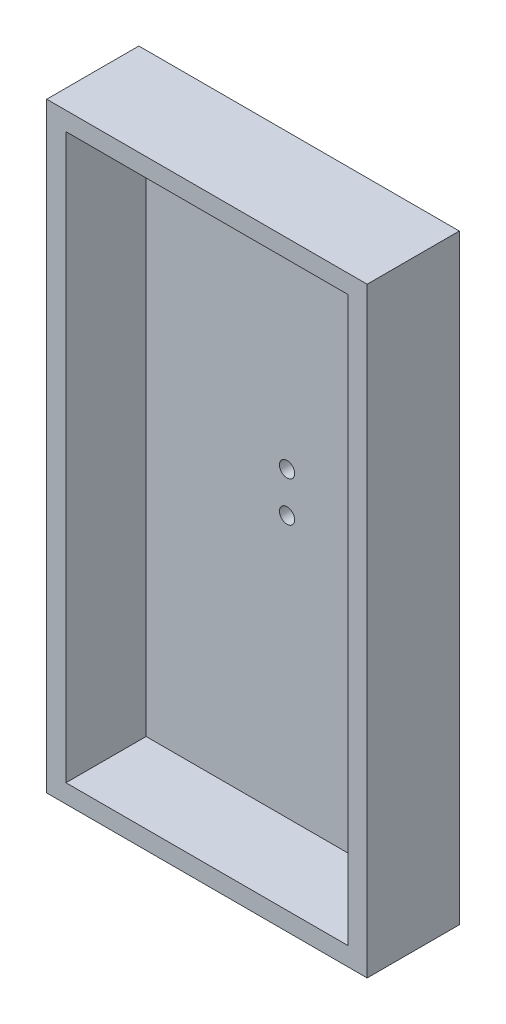
ISO-10303-21;
HEADER;
FILE_DESCRIPTION(('STEP AP214'),'2;1');
FILE_NAME('part.step','',(''),(''),'','','');
FILE_SCHEMA(('AUTOMOTIVE_DESIGN { 1 0 10303 214 1 1 1 1 }'));
ENDSEC;
DATA;
#1=APPLICATION_CONTEXT('core data for automotive mechanical design processes');
#2=APPLICATION_PROTOCOL_DEFINITION('international standard','automotive_design',2000,#1);
#3=PRODUCT_CONTEXT('',#1,'mechanical');
#4=PRODUCT('Part','Part','',(#3));
#5=PRODUCT_RELATED_PRODUCT_CATEGORY('part','',(#4));
#6=PRODUCT_DEFINITION_FORMATION('','',#4);
#7=PRODUCT_DEFINITION_CONTEXT('part definition',#1,'design');
#8=PRODUCT_DEFINITION('design','',#6,#7);
#9=PRODUCT_DEFINITION_SHAPE('','',#8);
#10=(LENGTH_UNIT() NAMED_UNIT(*) SI_UNIT(.MILLI.,.METRE.));
#11=(NAMED_UNIT(*) PLANE_ANGLE_UNIT() SI_UNIT($,.RADIAN.));
#12=(NAMED_UNIT(*) SI_UNIT($,.STERADIAN.) SOLID_ANGLE_UNIT());
#13=UNCERTAINTY_MEASURE_WITH_UNIT(LENGTH_MEASURE(1.E-05),#10,'distance_accuracy_value','');
#14=(GEOMETRIC_REPRESENTATION_CONTEXT(3) GLOBAL_UNCERTAINTY_ASSIGNED_CONTEXT((#13)) GLOBAL_UNIT_ASSIGNED_CONTEXT((#10,
#11,#12)) REPRESENTATION_CONTEXT('',''));
#15=CARTESIAN_POINT('',(0.,0.,0.));
#16=DIRECTION('',(0.,0.,1.));
#17=DIRECTION('',(1.,0.,0.));
#18=AXIS2_PLACEMENT_3D('',#15,#16,#17);
#19=CARTESIAN_POINT('',(40.,75.,3.));
#20=DIRECTION('',(-1.,0.,0.));
#21=DIRECTION('',(0.,-1.,0.));
#22=AXIS2_PLACEMENT_3D('',#19,#20,#21);
#23=PLANE('',#22);
#24=DIRECTION('',(0.,1.,0.));
#25=VECTOR('',#24,1.);
#26=CARTESIAN_POINT('',(40.,75.,0.));
#27=LINE('',#26,#25);
#28=CARTESIAN_POINT('',(40.,-75.,0.));
#29=VERTEX_POINT('',#28);
#30=CARTESIAN_POINT('',(40.,75.,0.));
#31=VERTEX_POINT('',#30);
#32=EDGE_CURVE('E243',#29,#31,#27,.T.);
#33=ORIENTED_EDGE('',*,*,#32,.T.);
#34=DIRECTION('',(0.,0.,-1.));
#35=VECTOR('',#34,1.);
#36=CARTESIAN_POINT('',(40.,75.,3.));
#37=LINE('',#36,#35);
#38=CARTESIAN_POINT('',(40.,75.,23.));
#39=VERTEX_POINT('',#38);
#40=EDGE_CURVE('E11',#39,#31,#37,.T.);
#41=ORIENTED_EDGE('',*,*,#40,.F.);
#42=DIRECTION('',(0.,1.,0.));
#43=VECTOR('',#42,1.);
#44=CARTESIAN_POINT('',(40.,75.,23.));
#45=LINE('',#44,#43);
#46=CARTESIAN_POINT('',(40.,-75.,23.));
#47=VERTEX_POINT('',#46);
#48=EDGE_CURVE('E144',#47,#39,#45,.T.);
#49=ORIENTED_EDGE('',*,*,#48,.F.);
#50=DIRECTION('',(0.,0.,-1.));
#51=VECTOR('',#50,1.);
#52=CARTESIAN_POINT('',(40.,-75.,3.));
#53=LINE('',#52,#51);
#54=EDGE_CURVE('E265',#47,#29,#53,.T.);
#55=ORIENTED_EDGE('',*,*,#54,.T.);
#56=EDGE_LOOP('',(#33,#41,#49,#55));
#57=FACE_BOUND('',#56,.T.);
#58=ADVANCED_FACE('F39',(#57),#23,.F.);
#59=CARTESIAN_POINT('',(-40.,75.,3.));
#60=DIRECTION('',(0.,-1.,0.));
#61=DIRECTION('',(0.,0.,-1.));
#62=AXIS2_PLACEMENT_3D('',#59,#60,#61);
#63=PLANE('',#62);
#64=DIRECTION('',(-1.,0.,0.));
#65=VECTOR('',#64,1.);
#66=CARTESIAN_POINT('',(-40.,75.,0.));
#67=LINE('',#66,#65);
#68=CARTESIAN_POINT('',(-40.,75.,0.));
#69=VERTEX_POINT('',#68);
#70=EDGE_CURVE('E256',#31,#69,#67,.T.);
#71=ORIENTED_EDGE('',*,*,#70,.T.);
#72=DIRECTION('',(0.,0.,-1.));
#73=VECTOR('',#72,1.);
#74=CARTESIAN_POINT('',(-40.,75.,3.));
#75=LINE('',#74,#73);
#76=CARTESIAN_POINT('',(-40.,75.,23.));
#77=VERTEX_POINT('',#76);
#78=EDGE_CURVE('E47',#77,#69,#75,.T.);
#79=ORIENTED_EDGE('',*,*,#78,.F.);
#80=DIRECTION('',(-1.,0.,0.));
#81=VECTOR('',#80,1.);
#82=CARTESIAN_POINT('',(-40.,75.,23.));
#83=LINE('',#82,#81);
#84=EDGE_CURVE('E179',#39,#77,#83,.T.);
#85=ORIENTED_EDGE('',*,*,#84,.F.);
#86=ORIENTED_EDGE('',*,*,#40,.T.);
#87=EDGE_LOOP('',(#71,#79,#85,#86));
#88=FACE_BOUND('',#87,.T.);
#89=ADVANCED_FACE('F290',(#88),#63,.F.);
#90=CARTESIAN_POINT('',(-40.,75.,3.));
#91=DIRECTION('',(1.,0.,0.));
#92=DIRECTION('',(0.,1.,0.));
#93=AXIS2_PLACEMENT_3D('',#90,#91,#92);
#94=PLANE('',#93);
#95=DIRECTION('',(0.,-1.,0.));
#96=VECTOR('',#95,1.);
#97=CARTESIAN_POINT('',(-40.,75.,0.));
#98=LINE('',#97,#96);
#99=CARTESIAN_POINT('',(-40.,-75.,0.));
#100=VERTEX_POINT('',#99);
#101=EDGE_CURVE('E259',#69,#100,#98,.T.);
#102=ORIENTED_EDGE('',*,*,#101,.T.);
#103=DIRECTION('',(0.,0.,-1.));
#104=VECTOR('',#103,1.);
#105=CARTESIAN_POINT('',(-40.,-75.,3.));
#106=LINE('',#105,#104);
#107=CARTESIAN_POINT('',(-40.,-75.,23.));
#108=VERTEX_POINT('',#107);
#109=EDGE_CURVE('E269',#108,#100,#106,.T.);
#110=ORIENTED_EDGE('',*,*,#109,.F.);
#111=DIRECTION('',(0.,-1.,0.));
#112=VECTOR('',#111,1.);
#113=CARTESIAN_POINT('',(-40.,75.,23.));
#114=LINE('',#113,#112);
#115=EDGE_CURVE('E183',#77,#108,#114,.T.);
#116=ORIENTED_EDGE('',*,*,#115,.F.);
#117=ORIENTED_EDGE('',*,*,#78,.T.);
#118=EDGE_LOOP('',(#102,#110,#116,#117));
#119=FACE_BOUND('',#118,.T.);
#120=ADVANCED_FACE('F277',(#119),#94,.F.);
#121=CARTESIAN_POINT('',(-40.,-75.,3.));
#122=DIRECTION('',(0.,1.,0.));
#123=DIRECTION('',(0.,0.,1.));
#124=AXIS2_PLACEMENT_3D('',#121,#122,#123);
#125=PLANE('',#124);
#126=DIRECTION('',(1.,0.,0.));
#127=VECTOR('',#126,1.);
#128=CARTESIAN_POINT('',(-40.,-75.,0.));
#129=LINE('',#128,#127);
#130=EDGE_CURVE('E262',#100,#29,#129,.T.);
#131=ORIENTED_EDGE('',*,*,#130,.T.);
#132=ORIENTED_EDGE('',*,*,#54,.F.);
#133=DIRECTION('',(1.,0.,0.));
#134=VECTOR('',#133,1.);
#135=CARTESIAN_POINT('',(-40.,-75.,23.));
#136=LINE('',#135,#134);
#137=EDGE_CURVE('E187',#108,#47,#136,.T.);
#138=ORIENTED_EDGE('',*,*,#137,.F.);
#139=ORIENTED_EDGE('',*,*,#109,.T.);
#140=EDGE_LOOP('',(#131,#132,#138,#139));
#141=FACE_BOUND('',#140,.T.);
#142=ADVANCED_FACE('F285',(#141),#125,.F.);
#143=CARTESIAN_POINT('',(0.,0.,3.));
#144=DIRECTION('',(0.,0.,1.));
#145=DIRECTION('',(1.,0.,0.));
#146=AXIS2_PLACEMENT_3D('',#143,#144,#145);
#147=PLANE('',#146);
#148=DIRECTION('',(0.,1.,0.));
#149=VECTOR('',#148,1.);
#150=CARTESIAN_POINT('',(35.1911737822088,70.3823475644175,3.));
#151=LINE('',#150,#149);
#152=CARTESIAN_POINT('',(35.1911737822088,-70.3823475644175,3.));
#153=VERTEX_POINT('',#152);
#154=CARTESIAN_POINT('',(35.1911737822088,70.3823475644175,3.));
#155=VERTEX_POINT('',#154);
#156=EDGE_CURVE('E54',#153,#155,#151,.T.);
#157=ORIENTED_EDGE('',*,*,#156,.T.);
#158=DIRECTION('',(-1.,0.,0.));
#159=VECTOR('',#158,1.);
#160=CARTESIAN_POINT('',(-35.1911737822088,70.3823475644175,3.));
#161=LINE('',#160,#159);
#162=CARTESIAN_POINT('',(-35.1911737822088,70.3823475644175,3.));
#163=VERTEX_POINT('',#162);
#164=EDGE_CURVE('E58',#155,#163,#161,.T.);
#165=ORIENTED_EDGE('',*,*,#164,.T.);
#166=DIRECTION('',(0.,-1.,0.));
#167=VECTOR('',#166,1.);
#168=CARTESIAN_POINT('',(-35.1911737822088,70.3823475644175,3.));
#169=LINE('',#168,#167);
#170=CARTESIAN_POINT('',(-35.1911737822088,-70.3823475644175,3.));
#171=VERTEX_POINT('',#170);
#172=EDGE_CURVE('E163',#163,#171,#169,.T.);
#173=ORIENTED_EDGE('',*,*,#172,.T.);
#174=DIRECTION('',(1.,0.,0.));
#175=VECTOR('',#174,1.);
#176=CARTESIAN_POINT('',(-35.1911737822088,-70.3823475644175,3.));
#177=LINE('',#176,#175);
#178=EDGE_CURVE('E138',#171,#153,#177,.T.);
#179=ORIENTED_EDGE('',*,*,#178,.T.);
#180=EDGE_LOOP('',(#157,#165,#173,#179));
#181=FACE_BOUND('',#180,.T.);
#182=CARTESIAN_POINT('',(0.,5.,3.));
#183=DIRECTION('',(0.,0.,-1.));
#184=DIRECTION('',(-1.,0.,0.));
#185=AXIS2_PLACEMENT_3D('',#182,#183,#184);
#186=CIRCLE('',#185,1.9);
#187=CARTESIAN_POINT('',(-1.9,5.,3.));
#188=VERTEX_POINT('',#187);
#189=EDGE_CURVE('E192',#188,#188,#186,.T.);
#190=ORIENTED_EDGE('',*,*,#189,.T.);
#191=EDGE_LOOP('',(#190));
#192=FACE_BOUND('',#191,.T.);
#193=CARTESIAN_POINT('',(0.,-5.,3.));
#194=DIRECTION('',(0.,0.,-1.));
#195=DIRECTION('',(1.,0.,0.));
#196=AXIS2_PLACEMENT_3D('',#193,#194,#195);
#197=CIRCLE('',#196,1.9);
#198=CARTESIAN_POINT('',(1.9,-5.,3.));
#199=VERTEX_POINT('',#198);
#200=EDGE_CURVE('E201',#199,#199,#197,.T.);
#201=ORIENTED_EDGE('',*,*,#200,.T.);
#202=EDGE_LOOP('',(#201));
#203=FACE_BOUND('',#202,.T.);
#204=ADVANCED_FACE('F300',(#181,#192,#203),#147,.T.);
#205=CARTESIAN_POINT('',(0.,0.,0.));
#206=DIRECTION('',(0.,0.,1.));
#207=DIRECTION('',(1.,0.,0.));
#208=AXIS2_PLACEMENT_3D('',#205,#206,#207);
#209=PLANE('',#208);
#210=DIRECTION('',(1.,0.,0.));
#211=VECTOR('',#210,1.);
#212=CARTESIAN_POINT('',(-6.,-11.,0.));
#213=LINE('',#212,#211);
#214=CARTESIAN_POINT('',(-6.,-11.,0.));
#215=VERTEX_POINT('',#214);
#216=CARTESIAN_POINT('',(6.,-11.,0.));
#217=VERTEX_POINT('',#216);
#218=EDGE_CURVE('E213',#215,#217,#213,.T.);
#219=ORIENTED_EDGE('',*,*,#218,.T.);
#220=DIRECTION('',(0.,1.,0.));
#221=VECTOR('',#220,1.);
#222=CARTESIAN_POINT('',(6.,11.,0.));
#223=LINE('',#222,#221);
#224=CARTESIAN_POINT('',(6.,11.,0.));
#225=VERTEX_POINT('',#224);
#226=EDGE_CURVE('E196',#217,#225,#223,.T.);
#227=ORIENTED_EDGE('',*,*,#226,.T.);
#228=DIRECTION('',(-1.,0.,0.));
#229=VECTOR('',#228,1.);
#230=CARTESIAN_POINT('',(-6.,11.,0.));
#231=LINE('',#230,#229);
#232=CARTESIAN_POINT('',(-6.,11.,0.));
#233=VERTEX_POINT('',#232);
#234=EDGE_CURVE('E229',#225,#233,#231,.T.);
#235=ORIENTED_EDGE('',*,*,#234,.T.);
#236=DIRECTION('',(0.,-1.,0.));
#237=VECTOR('',#236,1.);
#238=CARTESIAN_POINT('',(-6.,11.,0.));
#239=LINE('',#238,#237);
#240=EDGE_CURVE('E233',#233,#215,#239,.T.);
#241=ORIENTED_EDGE('',*,*,#240,.T.);
#242=EDGE_LOOP('',(#219,#227,#235,#241));
#243=FACE_BOUND('',#242,.T.);
#244=ORIENTED_EDGE('',*,*,#32,.F.);
#245=ORIENTED_EDGE('',*,*,#130,.F.);
#246=ORIENTED_EDGE('',*,*,#101,.F.);
#247=ORIENTED_EDGE('',*,*,#70,.F.);
#248=EDGE_LOOP('',(#244,#245,#246,#247));
#249=FACE_BOUND('',#248,.T.);
#250=ADVANCED_FACE('F283',(#243,#249),#209,.F.);
#251=CARTESIAN_POINT('',(6.,11.,-5.));
#252=DIRECTION('',(1.,0.,0.));
#253=DIRECTION('',(0.,1.,0.));
#254=AXIS2_PLACEMENT_3D('',#251,#252,#253);
#255=PLANE('',#254);
#256=ORIENTED_EDGE('',*,*,#226,.F.);
#257=DIRECTION('',(0.,0.,1.));
#258=VECTOR('',#257,1.);
#259=CARTESIAN_POINT('',(6.,-11.,-5.));
#260=LINE('',#259,#258);
#261=CARTESIAN_POINT('',(6.,-11.,-5.));
#262=VERTEX_POINT('',#261);
#263=EDGE_CURVE('E240',#262,#217,#260,.T.);
#264=ORIENTED_EDGE('',*,*,#263,.F.);
#265=DIRECTION('',(0.,1.,0.));
#266=VECTOR('',#265,1.);
#267=CARTESIAN_POINT('',(6.,11.,-5.));
#268=LINE('',#267,#266);
#269=CARTESIAN_POINT('',(6.,11.,-5.));
#270=VERTEX_POINT('',#269);
#271=EDGE_CURVE('E208',#262,#270,#268,.T.);
#272=ORIENTED_EDGE('',*,*,#271,.T.);
#273=DIRECTION('',(0.,0.,1.));
#274=VECTOR('',#273,1.);
#275=CARTESIAN_POINT('',(6.,11.,-5.));
#276=LINE('',#275,#274);
#277=EDGE_CURVE('E225',#270,#225,#276,.T.);
#278=ORIENTED_EDGE('',*,*,#277,.T.);
#279=EDGE_LOOP('',(#256,#264,#272,#278));
#280=FACE_BOUND('',#279,.T.);
#281=ADVANCED_FACE('F303',(#280),#255,.T.);
#282=CARTESIAN_POINT('',(-6.,-11.,-5.));
#283=DIRECTION('',(0.,-1.,0.));
#284=DIRECTION('',(0.,0.,-1.));
#285=AXIS2_PLACEMENT_3D('',#282,#283,#284);
#286=PLANE('',#285);
#287=ORIENTED_EDGE('',*,*,#218,.F.);
#288=DIRECTION('',(0.,0.,1.));
#289=VECTOR('',#288,1.);
#290=CARTESIAN_POINT('',(-6.,-11.,-5.));
#291=LINE('',#290,#289);
#292=CARTESIAN_POINT('',(-6.,-11.,-5.));
#293=VERTEX_POINT('',#292);
#294=EDGE_CURVE('E244',#293,#215,#291,.T.);
#295=ORIENTED_EDGE('',*,*,#294,.F.);
#296=DIRECTION('',(1.,0.,0.));
#297=VECTOR('',#296,1.);
#298=CARTESIAN_POINT('',(-6.,-11.,-5.));
#299=LINE('',#298,#297);
#300=EDGE_CURVE('E221',#293,#262,#299,.T.);
#301=ORIENTED_EDGE('',*,*,#300,.T.);
#302=ORIENTED_EDGE('',*,*,#263,.T.);
#303=EDGE_LOOP('',(#287,#295,#301,#302));
#304=FACE_BOUND('',#303,.T.);
#305=ADVANCED_FACE('F309',(#304),#286,.T.);
#306=CARTESIAN_POINT('',(-6.,11.,-5.));
#307=DIRECTION('',(-1.,0.,0.));
#308=DIRECTION('',(0.,-1.,0.));
#309=AXIS2_PLACEMENT_3D('',#306,#307,#308);
#310=PLANE('',#309);
#311=ORIENTED_EDGE('',*,*,#240,.F.);
#312=DIRECTION('',(0.,0.,1.));
#313=VECTOR('',#312,1.);
#314=CARTESIAN_POINT('',(-6.,11.,-5.));
#315=LINE('',#314,#313);
#316=CARTESIAN_POINT('',(-6.,11.,-5.));
#317=VERTEX_POINT('',#316);
#318=EDGE_CURVE('E247',#317,#233,#315,.T.);
#319=ORIENTED_EDGE('',*,*,#318,.F.);
#320=DIRECTION('',(0.,-1.,0.));
#321=VECTOR('',#320,1.);
#322=CARTESIAN_POINT('',(-6.,11.,-5.));
#323=LINE('',#322,#321);
#324=EDGE_CURVE('E217',#317,#293,#323,.T.);
#325=ORIENTED_EDGE('',*,*,#324,.T.);
#326=ORIENTED_EDGE('',*,*,#294,.T.);
#327=EDGE_LOOP('',(#311,#319,#325,#326));
#328=FACE_BOUND('',#327,.T.);
#329=ADVANCED_FACE('F315',(#328),#310,.T.);
#330=CARTESIAN_POINT('',(-6.,11.,-5.));
#331=DIRECTION('',(0.,1.,0.));
#332=DIRECTION('',(0.,0.,1.));
#333=AXIS2_PLACEMENT_3D('',#330,#331,#332);
#334=PLANE('',#333);
#335=ORIENTED_EDGE('',*,*,#234,.F.);
#336=ORIENTED_EDGE('',*,*,#277,.F.);
#337=DIRECTION('',(-1.,0.,0.));
#338=VECTOR('',#337,1.);
#339=CARTESIAN_POINT('',(-6.,11.,-5.));
#340=LINE('',#339,#338);
#341=EDGE_CURVE('E212',#270,#317,#340,.T.);
#342=ORIENTED_EDGE('',*,*,#341,.T.);
#343=ORIENTED_EDGE('',*,*,#318,.T.);
#344=EDGE_LOOP('',(#335,#336,#342,#343));
#345=FACE_BOUND('',#344,.T.);
#346=ADVANCED_FACE('F311',(#345),#334,.T.);
#347=CARTESIAN_POINT('',(0.,0.,-5.));
#348=DIRECTION('',(0.,0.,1.));
#349=DIRECTION('',(1.,0.,0.));
#350=AXIS2_PLACEMENT_3D('',#347,#348,#349);
#351=PLANE('',#350);
#352=CARTESIAN_POINT('',(0.,5.,-5.));
#353=DIRECTION('',(0.,0.,-1.));
#354=DIRECTION('',(-1.,0.,0.));
#355=AXIS2_PLACEMENT_3D('',#352,#353,#354);
#356=CIRCLE('',#355,1.9);
#357=CARTESIAN_POINT('',(-1.9,5.,-5.));
#358=VERTEX_POINT('',#357);
#359=EDGE_CURVE('E197',#358,#358,#356,.T.);
#360=ORIENTED_EDGE('',*,*,#359,.F.);
#361=EDGE_LOOP('',(#360));
#362=FACE_BOUND('',#361,.T.);
#363=CARTESIAN_POINT('',(0.,-5.,-5.));
#364=DIRECTION('',(0.,0.,-1.));
#365=DIRECTION('',(1.,0.,0.));
#366=AXIS2_PLACEMENT_3D('',#363,#364,#365);
#367=CIRCLE('',#366,1.9);
#368=CARTESIAN_POINT('',(1.9,-5.,-5.));
#369=VERTEX_POINT('',#368);
#370=EDGE_CURVE('E191',#369,#369,#367,.T.);
#371=ORIENTED_EDGE('',*,*,#370,.F.);
#372=EDGE_LOOP('',(#371));
#373=FACE_BOUND('',#372,.T.);
#374=ORIENTED_EDGE('',*,*,#271,.F.);
#375=ORIENTED_EDGE('',*,*,#300,.F.);
#376=ORIENTED_EDGE('',*,*,#324,.F.);
#377=ORIENTED_EDGE('',*,*,#341,.F.);
#378=EDGE_LOOP('',(#374,#375,#376,#377));
#379=FACE_BOUND('',#378,.T.);
#380=ADVANCED_FACE('F314',(#362,#373,#379),#351,.F.);
#381=CARTESIAN_POINT('',(0.,-5.,3.));
#382=DIRECTION('',(0.,0.,-1.));
#383=DIRECTION('',(-1.,0.,0.));
#384=AXIS2_PLACEMENT_3D('',#381,#382,#383);
#385=CYLINDRICAL_SURFACE('',#384,1.9);
#386=ORIENTED_EDGE('',*,*,#200,.F.);
#387=EDGE_LOOP('',(#386));
#388=FACE_BOUND('',#387,.T.);
#389=ORIENTED_EDGE('',*,*,#370,.T.);
#390=EDGE_LOOP('',(#389));
#391=FACE_BOUND('',#390,.T.);
#392=ADVANCED_FACE('F325',(#388,#391),#385,.F.);
#393=CARTESIAN_POINT('',(0.,5.,3.));
#394=DIRECTION('',(0.,0.,-1.));
#395=DIRECTION('',(-1.,0.,0.));
#396=AXIS2_PLACEMENT_3D('',#393,#394,#395);
#397=CYLINDRICAL_SURFACE('',#396,1.9);
#398=ORIENTED_EDGE('',*,*,#189,.F.);
#399=EDGE_LOOP('',(#398));
#400=FACE_BOUND('',#399,.T.);
#401=ORIENTED_EDGE('',*,*,#359,.T.);
#402=EDGE_LOOP('',(#401));
#403=FACE_BOUND('',#402,.T.);
#404=ADVANCED_FACE('F329',(#400,#403),#397,.F.);
#405=CARTESIAN_POINT('',(0.,0.,23.));
#406=DIRECTION('',(0.,0.,1.));
#407=DIRECTION('',(1.,0.,0.));
#408=AXIS2_PLACEMENT_3D('',#405,#406,#407);
#409=PLANE('',#408);
#410=ORIENTED_EDGE('',*,*,#48,.T.);
#411=ORIENTED_EDGE('',*,*,#84,.T.);
#412=ORIENTED_EDGE('',*,*,#115,.T.);
#413=ORIENTED_EDGE('',*,*,#137,.T.);
#414=EDGE_LOOP('',(#410,#411,#412,#413));
#415=FACE_BOUND('',#414,.T.);
#416=DIRECTION('',(-1.,0.,0.));
#417=VECTOR('',#416,1.);
#418=CARTESIAN_POINT('',(-35.1911737822088,70.3823475644175,23.));
#419=LINE('',#418,#417);
#420=CARTESIAN_POINT('',(35.1911737822088,70.3823475644175,23.));
#421=VERTEX_POINT('',#420);
#422=CARTESIAN_POINT('',(-35.1911737822088,70.3823475644175,23.));
#423=VERTEX_POINT('',#422);
#424=EDGE_CURVE('E137',#421,#423,#419,.T.);
#425=ORIENTED_EDGE('',*,*,#424,.F.);
#426=DIRECTION('',(0.,1.,0.));
#427=VECTOR('',#426,1.);
#428=CARTESIAN_POINT('',(35.1911737822088,70.3823475644175,23.));
#429=LINE('',#428,#427);
#430=CARTESIAN_POINT('',(35.1911737822088,-70.3823475644175,23.));
#431=VERTEX_POINT('',#430);
#432=EDGE_CURVE('E127',#431,#421,#429,.T.);
#433=ORIENTED_EDGE('',*,*,#432,.F.);
#434=DIRECTION('',(1.,0.,0.));
#435=VECTOR('',#434,1.);
#436=CARTESIAN_POINT('',(-35.1911737822088,-70.3823475644175,23.));
#437=LINE('',#436,#435);
#438=CARTESIAN_POINT('',(-35.1911737822088,-70.3823475644175,23.));
#439=VERTEX_POINT('',#438);
#440=EDGE_CURVE('E154',#439,#431,#437,.T.);
#441=ORIENTED_EDGE('',*,*,#440,.F.);
#442=DIRECTION('',(0.,-1.,0.));
#443=VECTOR('',#442,1.);
#444=CARTESIAN_POINT('',(-35.1911737822088,70.3823475644175,23.));
#445=LINE('',#444,#443);
#446=EDGE_CURVE('E150',#423,#439,#445,.T.);
#447=ORIENTED_EDGE('',*,*,#446,.F.);
#448=EDGE_LOOP('',(#425,#433,#441,#447));
#449=FACE_BOUND('',#448,.T.);
#450=ADVANCED_FACE('F148',(#415,#449),#409,.T.);
#451=CARTESIAN_POINT('',(35.1911737822088,70.3823475644175,23.));
#452=DIRECTION('',(-1.,0.,0.));
#453=DIRECTION('',(0.,0.,1.));
#454=AXIS2_PLACEMENT_3D('',#451,#452,#453);
#455=PLANE('',#454);
#456=ORIENTED_EDGE('',*,*,#156,.F.);
#457=DIRECTION('',(0.,0.,-1.));
#458=VECTOR('',#457,1.);
#459=CARTESIAN_POINT('',(35.1911737822088,-70.3823475644175,23.));
#460=LINE('',#459,#458);
#461=EDGE_CURVE('E132',#431,#153,#460,.T.);
#462=ORIENTED_EDGE('',*,*,#461,.F.);
#463=ORIENTED_EDGE('',*,*,#432,.T.);
#464=DIRECTION('',(0.,0.,-1.));
#465=VECTOR('',#464,1.);
#466=CARTESIAN_POINT('',(35.1911737822088,70.3823475644175,23.));
#467=LINE('',#466,#465);
#468=EDGE_CURVE('E130',#421,#155,#467,.T.);
#469=ORIENTED_EDGE('',*,*,#468,.T.);
#470=EDGE_LOOP('',(#456,#462,#463,#469));
#471=FACE_BOUND('',#470,.T.);
#472=ADVANCED_FACE('F129',(#471),#455,.T.);
#473=CARTESIAN_POINT('',(-35.1911737822088,70.3823475644175,23.));
#474=DIRECTION('',(0.,-1.,0.));
#475=DIRECTION('',(0.,0.,-1.));
#476=AXIS2_PLACEMENT_3D('',#473,#474,#475);
#477=PLANE('',#476);
#478=ORIENTED_EDGE('',*,*,#164,.F.);
#479=ORIENTED_EDGE('',*,*,#468,.F.);
#480=ORIENTED_EDGE('',*,*,#424,.T.);
#481=DIRECTION('',(0.,0.,-1.));
#482=VECTOR('',#481,1.);
#483=CARTESIAN_POINT('',(-35.1911737822088,70.3823475644175,23.));
#484=LINE('',#483,#482);
#485=EDGE_CURVE('E145',#423,#163,#484,.T.);
#486=ORIENTED_EDGE('',*,*,#485,.T.);
#487=EDGE_LOOP('',(#478,#479,#480,#486));
#488=FACE_BOUND('',#487,.T.);
#489=ADVANCED_FACE('F141',(#488),#477,.T.);
#490=CARTESIAN_POINT('',(-35.1911737822088,70.3823475644175,23.));
#491=DIRECTION('',(1.,0.,0.));
#492=DIRECTION('',(0.,0.,-1.));
#493=AXIS2_PLACEMENT_3D('',#490,#491,#492);
#494=PLANE('',#493);
#495=ORIENTED_EDGE('',*,*,#172,.F.);
#496=ORIENTED_EDGE('',*,*,#485,.F.);
#497=ORIENTED_EDGE('',*,*,#446,.T.);
#498=DIRECTION('',(0.,0.,-1.));
#499=VECTOR('',#498,1.);
#500=CARTESIAN_POINT('',(-35.1911737822088,-70.3823475644175,23.));
#501=LINE('',#500,#499);
#502=EDGE_CURVE('E170',#439,#171,#501,.T.);
#503=ORIENTED_EDGE('',*,*,#502,.T.);
#504=EDGE_LOOP('',(#495,#496,#497,#503));
#505=FACE_BOUND('',#504,.T.);
#506=ADVANCED_FACE('F340',(#505),#494,.T.);
#507=CARTESIAN_POINT('',(-35.1911737822088,-70.3823475644175,23.));
#508=DIRECTION('',(0.,1.,0.));
#509=DIRECTION('',(0.,0.,1.));
#510=AXIS2_PLACEMENT_3D('',#507,#508,#509);
#511=PLANE('',#510);
#512=ORIENTED_EDGE('',*,*,#178,.F.);
#513=ORIENTED_EDGE('',*,*,#502,.F.);
#514=ORIENTED_EDGE('',*,*,#440,.T.);
#515=ORIENTED_EDGE('',*,*,#461,.T.);
#516=EDGE_LOOP('',(#512,#513,#514,#515));
#517=FACE_BOUND('',#516,.T.);
#518=ADVANCED_FACE('F343',(#517),#511,.T.);
#519=CLOSED_SHELL('',(#58,#89,#120,#142,#204,#250,#281,#305,#329,#346,#380,#392,#404,#450,#472,
#489,#506,#518));
#520=MANIFOLD_SOLID_BREP('B2',#519);
#521=ADVANCED_BREP_SHAPE_REPRESENTATION('',(#18,#520),#14);
#522=SHAPE_DEFINITION_REPRESENTATION(#9,#521);
ENDSEC;
END-ISO-10303-21;
